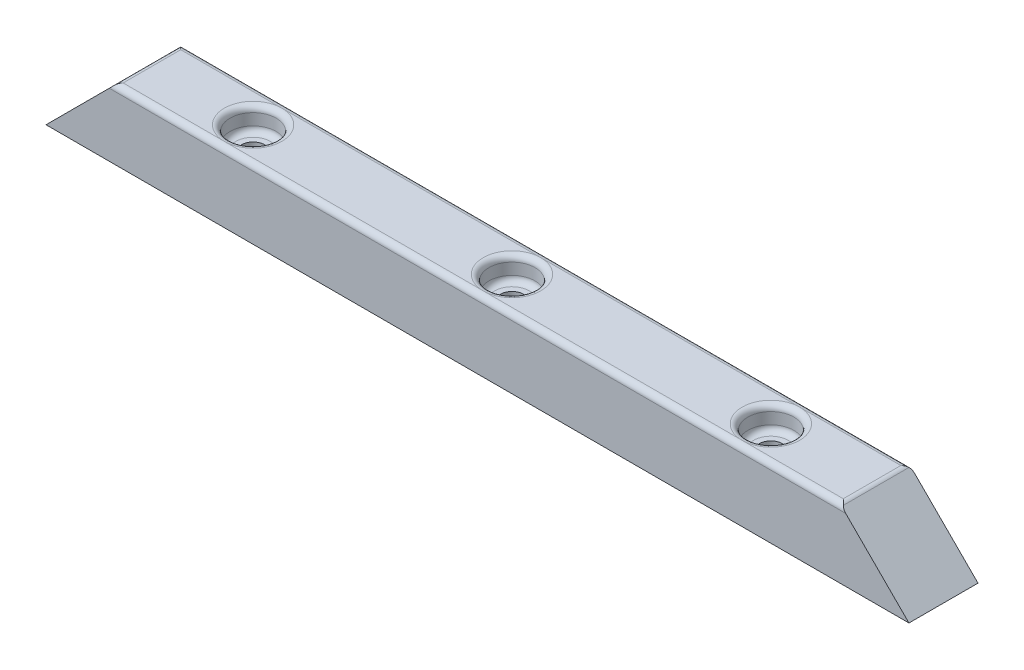
ISO-10303-21;
HEADER;
FILE_DESCRIPTION(('STEP AP214'),'2;1');
FILE_NAME('part.step','',(''),(''),'','','');
FILE_SCHEMA(('AUTOMOTIVE_DESIGN { 1 0 10303 214 1 1 1 1 }'));
ENDSEC;
DATA;
#1=APPLICATION_CONTEXT('core data for automotive mechanical design processes');
#2=APPLICATION_PROTOCOL_DEFINITION('international standard','automotive_design',2000,#1);
#3=PRODUCT_CONTEXT('',#1,'mechanical');
#4=PRODUCT('Part','Part','',(#3));
#5=PRODUCT_RELATED_PRODUCT_CATEGORY('part','',(#4));
#6=PRODUCT_DEFINITION_FORMATION('','',#4);
#7=PRODUCT_DEFINITION_CONTEXT('part definition',#1,'design');
#8=PRODUCT_DEFINITION('design','',#6,#7);
#9=PRODUCT_DEFINITION_SHAPE('','',#8);
#10=(LENGTH_UNIT() NAMED_UNIT(*) SI_UNIT(.MILLI.,.METRE.));
#11=(NAMED_UNIT(*) PLANE_ANGLE_UNIT() SI_UNIT($,.RADIAN.));
#12=(NAMED_UNIT(*) SI_UNIT($,.STERADIAN.) SOLID_ANGLE_UNIT());
#13=UNCERTAINTY_MEASURE_WITH_UNIT(LENGTH_MEASURE(1.E-05),#10,'distance_accuracy_value','');
#14=(GEOMETRIC_REPRESENTATION_CONTEXT(3) GLOBAL_UNCERTAINTY_ASSIGNED_CONTEXT((#13)) GLOBAL_UNIT_ASSIGNED_CONTEXT((#10,
#11,#12)) REPRESENTATION_CONTEXT('',''));
#15=CARTESIAN_POINT('',(0.,0.,0.));
#16=DIRECTION('',(0.,0.,1.));
#17=DIRECTION('',(1.,0.,0.));
#18=AXIS2_PLACEMENT_3D('',#15,#16,#17);
#19=CARTESIAN_POINT('',(-63.0000000000001,6.,12.));
#20=DIRECTION('',(0.,-1.,0.));
#21=DIRECTION('',(1.,0.,0.));
#22=AXIS2_PLACEMENT_3D('',#19,#20,#21);
#23=PLANE('',#22);
#24=DIRECTION('',(0.,0.,-1.));
#25=VECTOR('',#24,1.);
#26=CARTESIAN_POINT('',(-62.585786437627,6.,12.));
#27=LINE('',#26,#25);
#28=CARTESIAN_POINT('',(-62.585786437627,6.,1.));
#29=VERTEX_POINT('',#28);
#30=CARTESIAN_POINT('',(-62.585786437627,6.,11.));
#31=VERTEX_POINT('',#30);
#32=EDGE_CURVE('E213',#29,#31,#27,.F.);
#33=ORIENTED_EDGE('',*,*,#32,.T.);
#34=DIRECTION('',(-1.,0.,0.));
#35=VECTOR('',#34,1.);
#36=CARTESIAN_POINT('',(62.9999999999998,6.,11.));
#37=LINE('',#36,#35);
#38=CARTESIAN_POINT('',(-45.0000000000002,6.,11.));
#39=VERTEX_POINT('',#38);
#40=EDGE_CURVE('E222',#31,#39,#37,.F.);
#41=ORIENTED_EDGE('',*,*,#40,.T.);
#42=CARTESIAN_POINT('',(-45.0000000000002,6.,6.00000000000001));
#43=DIRECTION('',(0.,-1.,0.));
#44=DIRECTION('',(1.,0.,0.));
#45=AXIS2_PLACEMENT_3D('',#42,#43,#44);
#46=CIRCLE('',#45,5.);
#47=CARTESIAN_POINT('',(-45.0000000000002,6.,1.));
#48=VERTEX_POINT('',#47);
#49=EDGE_CURVE('E169',#39,#48,#46,.T.);
#50=ORIENTED_EDGE('',*,*,#49,.T.);
#51=DIRECTION('',(-1.,0.,0.));
#52=VECTOR('',#51,1.);
#53=CARTESIAN_POINT('',(-63.0000000000001,6.,1.));
#54=LINE('',#53,#52);
#55=EDGE_CURVE('E203',#48,#29,#54,.T.);
#56=ORIENTED_EDGE('',*,*,#55,.T.);
#57=EDGE_LOOP('',(#33,#41,#50,#56));
#58=FACE_BOUND('',#57,.T.);
#59=ADVANCED_FACE('F36',(#58),#23,.F.);
#60=EDGE_CURVE('E168',#48,#39,#46,.T.);
#61=ORIENTED_EDGE('',*,*,#60,.T.);
#62=DIRECTION('',(-1.,0.,0.));
#63=VECTOR('',#62,1.);
#64=CARTESIAN_POINT('',(62.9999999999998,6.,11.));
#65=LINE('',#64,#63);
#66=CARTESIAN_POINT('',(-1.80369938561684E-13,6.,11.));
#67=VERTEX_POINT('',#66);
#68=EDGE_CURVE('E220',#39,#67,#65,.F.);
#69=ORIENTED_EDGE('',*,*,#68,.T.);
#70=CARTESIAN_POINT('',(-1.80369938561684E-13,6.,6.));
#71=DIRECTION('',(0.,-1.,0.));
#72=DIRECTION('',(1.,0.,0.));
#73=AXIS2_PLACEMENT_3D('',#70,#71,#72);
#74=CIRCLE('',#73,5.);
#75=CARTESIAN_POINT('',(-1.80369938561684E-13,6.,1.));
#76=VERTEX_POINT('',#75);
#77=EDGE_CURVE('E161',#67,#76,#74,.T.);
#78=ORIENTED_EDGE('',*,*,#77,.T.);
#79=DIRECTION('',(-1.,0.,0.));
#80=VECTOR('',#79,1.);
#81=CARTESIAN_POINT('',(-63.0000000000001,6.,1.));
#82=LINE('',#81,#80);
#83=EDGE_CURVE('E205',#76,#48,#82,.T.);
#84=ORIENTED_EDGE('',*,*,#83,.T.);
#85=EDGE_LOOP('',(#61,#69,#78,#84));
#86=FACE_BOUND('',#85,.T.);
#87=ADVANCED_FACE('F265',(#86),#23,.F.);
#88=EDGE_CURVE('E146',#76,#67,#74,.T.);
#89=ORIENTED_EDGE('',*,*,#88,.T.);
#90=DIRECTION('',(-1.,0.,0.));
#91=VECTOR('',#90,1.);
#92=CARTESIAN_POINT('',(62.9999999999998,6.,11.));
#93=LINE('',#92,#91);
#94=CARTESIAN_POINT('',(44.9999999999998,6.,11.));
#95=VERTEX_POINT('',#94);
#96=EDGE_CURVE('E218',#67,#95,#93,.F.);
#97=ORIENTED_EDGE('',*,*,#96,.T.);
#98=CARTESIAN_POINT('',(44.9999999999998,6.,6.));
#99=DIRECTION('',(0.,-1.,0.));
#100=DIRECTION('',(1.,0.,0.));
#101=AXIS2_PLACEMENT_3D('',#98,#99,#100);
#102=CIRCLE('',#101,5.);
#103=CARTESIAN_POINT('',(44.9999999999998,6.,1.));
#104=VERTEX_POINT('',#103);
#105=EDGE_CURVE('E165',#95,#104,#102,.T.);
#106=ORIENTED_EDGE('',*,*,#105,.T.);
#107=DIRECTION('',(-1.,0.,0.));
#108=VECTOR('',#107,1.);
#109=CARTESIAN_POINT('',(-63.0000000000001,6.,1.));
#110=LINE('',#109,#108);
#111=EDGE_CURVE('E207',#104,#76,#110,.T.);
#112=ORIENTED_EDGE('',*,*,#111,.T.);
#113=EDGE_LOOP('',(#89,#97,#106,#112));
#114=FACE_BOUND('',#113,.T.);
#115=ADVANCED_FACE('F255',(#114),#23,.F.);
#116=CARTESIAN_POINT('',(-1.80452544441492E-13,-6.,6.));
#117=DIRECTION('',(0.,1.,0.));
#118=DIRECTION('',(-1.,0.,0.));
#119=AXIS2_PLACEMENT_3D('',#116,#117,#118);
#120=CYLINDRICAL_SURFACE('',#119,2.);
#121=CARTESIAN_POINT('',(-1.80452544441492E-13,-6.,6.));
#122=DIRECTION('',(0.,1.,0.));
#123=DIRECTION('',(-1.,0.,0.));
#124=AXIS2_PLACEMENT_3D('',#121,#122,#123);
#125=CIRCLE('',#124,2.);
#126=CARTESIAN_POINT('',(-2.00000000000018,-6.,6.));
#127=VERTEX_POINT('',#126);
#128=EDGE_CURVE('E412',#127,#127,#125,.T.);
#129=ORIENTED_EDGE('',*,*,#128,.F.);
#130=EDGE_LOOP('',(#129));
#131=FACE_BOUND('',#130,.T.);
#132=CARTESIAN_POINT('',(-1.80397473854953E-13,2.,6.));
#133=DIRECTION('',(0.,1.,0.));
#134=DIRECTION('',(-1.,0.,0.));
#135=AXIS2_PLACEMENT_3D('',#132,#133,#134);
#136=CIRCLE('',#135,2.);
#137=CARTESIAN_POINT('',(-2.00000000000018,2.,6.));
#138=VERTEX_POINT('',#137);
#139=EDGE_CURVE('E157',#138,#138,#136,.F.);
#140=ORIENTED_EDGE('',*,*,#139,.F.);
#141=EDGE_LOOP('',(#140));
#142=FACE_BOUND('',#141,.T.);
#143=ADVANCED_FACE('F314',(#131,#142),#120,.F.);
#144=CARTESIAN_POINT('',(44.9999999999998,-6.,6.));
#145=DIRECTION('',(0.,1.,0.));
#146=DIRECTION('',(-1.,0.,0.));
#147=AXIS2_PLACEMENT_3D('',#144,#145,#146);
#148=CYLINDRICAL_SURFACE('',#147,2.);
#149=CARTESIAN_POINT('',(44.9999999999998,-6.,6.));
#150=DIRECTION('',(0.,1.,0.));
#151=DIRECTION('',(-1.,0.,0.));
#152=AXIS2_PLACEMENT_3D('',#149,#150,#151);
#153=CIRCLE('',#152,2.);
#154=CARTESIAN_POINT('',(42.9999999999998,-6.,6.));
#155=VERTEX_POINT('',#154);
#156=EDGE_CURVE('E409',#155,#155,#153,.T.);
#157=ORIENTED_EDGE('',*,*,#156,.F.);
#158=EDGE_LOOP('',(#157));
#159=FACE_BOUND('',#158,.T.);
#160=CARTESIAN_POINT('',(44.9999999999998,2.,6.));
#161=DIRECTION('',(0.,1.,0.));
#162=DIRECTION('',(-1.,0.,0.));
#163=AXIS2_PLACEMENT_3D('',#160,#161,#162);
#164=CIRCLE('',#163,2.);
#165=CARTESIAN_POINT('',(42.9999999999998,2.,6.));
#166=VERTEX_POINT('',#165);
#167=EDGE_CURVE('E154',#166,#166,#164,.F.);
#168=ORIENTED_EDGE('',*,*,#167,.F.);
#169=EDGE_LOOP('',(#168));
#170=FACE_BOUND('',#169,.T.);
#171=ADVANCED_FACE('F318',(#159,#170),#148,.F.);
#172=CARTESIAN_POINT('',(-45.0000000000002,-6.,6.00000000000001));
#173=DIRECTION('',(0.,1.,0.));
#174=DIRECTION('',(-1.,0.,0.));
#175=AXIS2_PLACEMENT_3D('',#172,#173,#174);
#176=CYLINDRICAL_SURFACE('',#175,2.);
#177=CARTESIAN_POINT('',(-45.0000000000002,-6.,6.00000000000001));
#178=DIRECTION('',(0.,1.,0.));
#179=DIRECTION('',(-1.,0.,0.));
#180=AXIS2_PLACEMENT_3D('',#177,#178,#179);
#181=CIRCLE('',#180,2.);
#182=CARTESIAN_POINT('',(-47.0000000000002,-6.,6.00000000000001));
#183=VERTEX_POINT('',#182);
#184=EDGE_CURVE('E159',#183,#183,#181,.T.);
#185=ORIENTED_EDGE('',*,*,#184,.F.);
#186=EDGE_LOOP('',(#185));
#187=FACE_BOUND('',#186,.T.);
#188=CARTESIAN_POINT('',(-45.0000000000002,2.,6.00000000000001));
#189=DIRECTION('',(0.,1.,0.));
#190=DIRECTION('',(-1.,0.,0.));
#191=AXIS2_PLACEMENT_3D('',#188,#189,#190);
#192=CIRCLE('',#191,2.);
#193=CARTESIAN_POINT('',(-47.0000000000002,2.,6.00000000000001));
#194=VERTEX_POINT('',#193);
#195=EDGE_CURVE('E151',#194,#194,#192,.F.);
#196=ORIENTED_EDGE('',*,*,#195,.F.);
#197=EDGE_LOOP('',(#196));
#198=FACE_BOUND('',#197,.T.);
#199=ADVANCED_FACE('F324',(#187,#198),#176,.F.);
#200=CARTESIAN_POINT('',(-75.0000000000001,-6.,12.));
#201=DIRECTION('',(0.,1.,0.));
#202=DIRECTION('',(0.,0.,1.));
#203=AXIS2_PLACEMENT_3D('',#200,#201,#202);
#204=PLANE('',#203);
#205=ORIENTED_EDGE('',*,*,#184,.T.);
#206=EDGE_LOOP('',(#205));
#207=FACE_BOUND('',#206,.T.);
#208=ORIENTED_EDGE('',*,*,#156,.T.);
#209=EDGE_LOOP('',(#208));
#210=FACE_BOUND('',#209,.T.);
#211=ORIENTED_EDGE('',*,*,#128,.T.);
#212=EDGE_LOOP('',(#211));
#213=FACE_BOUND('',#212,.T.);
#214=DIRECTION('',(1.,0.,0.));
#215=VECTOR('',#214,1.);
#216=CARTESIAN_POINT('',(-75.0000000000001,-6.,0.));
#217=LINE('',#216,#215);
#218=CARTESIAN_POINT('',(-75.0000000000001,-6.,0.));
#219=VERTEX_POINT('',#218);
#220=CARTESIAN_POINT('',(74.9999999999999,-6.,0.));
#221=VERTEX_POINT('',#220);
#222=EDGE_CURVE('E141',#219,#221,#217,.T.);
#223=ORIENTED_EDGE('',*,*,#222,.T.);
#224=DIRECTION('',(0.,0.,-1.));
#225=VECTOR('',#224,1.);
#226=CARTESIAN_POINT('',(74.9999999999999,-6.,12.));
#227=LINE('',#226,#225);
#228=CARTESIAN_POINT('',(74.9999999999999,-6.,12.));
#229=VERTEX_POINT('',#228);
#230=EDGE_CURVE('E122',#229,#221,#227,.T.);
#231=ORIENTED_EDGE('',*,*,#230,.F.);
#232=DIRECTION('',(1.,0.,0.));
#233=VECTOR('',#232,1.);
#234=CARTESIAN_POINT('',(-75.0000000000001,-6.,12.));
#235=LINE('',#234,#233);
#236=CARTESIAN_POINT('',(-75.0000000000001,-6.,12.));
#237=VERTEX_POINT('',#236);
#238=EDGE_CURVE('E129',#237,#229,#235,.T.);
#239=ORIENTED_EDGE('',*,*,#238,.F.);
#240=DIRECTION('',(0.,0.,-1.));
#241=VECTOR('',#240,1.);
#242=CARTESIAN_POINT('',(-75.0000000000001,-6.,12.));
#243=LINE('',#242,#241);
#244=EDGE_CURVE('E143',#237,#219,#243,.T.);
#245=ORIENTED_EDGE('',*,*,#244,.T.);
#246=EDGE_LOOP('',(#223,#231,#239,#245));
#247=FACE_BOUND('',#246,.T.);
#248=ADVANCED_FACE('F139',(#207,#210,#213,#247),#204,.F.);
#249=CARTESIAN_POINT('',(74.9999999999999,-6.,12.));
#250=DIRECTION('',(-0.707106781186544,-0.707106781186551,0.));
#251=DIRECTION('',(0.707106781186551,-0.707106781186544,0.));
#252=AXIS2_PLACEMENT_3D('',#249,#250,#251);
#253=PLANE('',#252);
#254=DIRECTION('',(0.,0.,-1.));
#255=VECTOR('',#254,1.);
#256=CARTESIAN_POINT('',(63.2928932188132,5.70710678118653,12.));
#257=LINE('',#256,#255);
#258=CARTESIAN_POINT('',(63.2928932188132,5.70710678118653,0.292893218813444));
#259=VERTEX_POINT('',#258);
#260=CARTESIAN_POINT('',(63.2928932188132,5.70710678118653,11.7071067811866));
#261=VERTEX_POINT('',#260);
#262=EDGE_CURVE('E53',#259,#261,#257,.F.);
#263=ORIENTED_EDGE('',*,*,#262,.T.);
#264=CARTESIAN_POINT('',(63.9999999999998,5.,11.));
#265=DIRECTION('',(-0.707106781186544,-0.707106781186551,0.));
#266=DIRECTION('',(0.707106781186551,-0.707106781186544,0.));
#267=AXIS2_PLACEMENT_3D('',#264,#265,#266);
#268=ELLIPSE('',#267,1.4142135623731,1.);
#269=CARTESIAN_POINT('',(63.9999999999998,5.,12.));
#270=VERTEX_POINT('',#269);
#271=EDGE_CURVE('E125',#261,#270,#268,.F.);
#272=ORIENTED_EDGE('',*,*,#271,.T.);
#273=DIRECTION('',(-0.707106781186552,0.707106781186544,0.));
#274=VECTOR('',#273,1.);
#275=CARTESIAN_POINT('',(74.9999999999999,-6.,12.));
#276=LINE('',#275,#274);
#277=EDGE_CURVE('E118',#229,#270,#276,.T.);
#278=ORIENTED_EDGE('',*,*,#277,.F.);
#279=ORIENTED_EDGE('',*,*,#230,.T.);
#280=DIRECTION('',(-0.707106781186552,0.707106781186544,0.));
#281=VECTOR('',#280,1.);
#282=CARTESIAN_POINT('',(74.9999999999999,-6.,0.));
#283=LINE('',#282,#281);
#284=CARTESIAN_POINT('',(63.9999999999998,5.,0.));
#285=VERTEX_POINT('',#284);
#286=EDGE_CURVE('E344',#221,#285,#283,.T.);
#287=ORIENTED_EDGE('',*,*,#286,.T.);
#288=CARTESIAN_POINT('',(63.9999999999998,5.,1.));
#289=DIRECTION('',(-0.707106781186544,-0.707106781186551,0.));
#290=DIRECTION('',(-0.707106781186551,0.707106781186544,0.));
#291=AXIS2_PLACEMENT_3D('',#288,#289,#290);
#292=ELLIPSE('',#291,1.4142135623731,1.);
#293=EDGE_CURVE('E58',#285,#259,#292,.F.);
#294=ORIENTED_EDGE('',*,*,#293,.T.);
#295=EDGE_LOOP('',(#263,#272,#278,#279,#287,#294));
#296=FACE_BOUND('',#295,.T.);
#297=ADVANCED_FACE('F120',(#296),#253,.F.);
#298=EDGE_CURVE('E164',#104,#95,#102,.T.);
#299=ORIENTED_EDGE('',*,*,#298,.T.);
#300=DIRECTION('',(-1.,0.,0.));
#301=VECTOR('',#300,1.);
#302=CARTESIAN_POINT('',(62.9999999999998,6.,11.));
#303=LINE('',#302,#301);
#304=CARTESIAN_POINT('',(62.5857864376267,6.,11.));
#305=VERTEX_POINT('',#304);
#306=EDGE_CURVE('E216',#95,#305,#303,.F.);
#307=ORIENTED_EDGE('',*,*,#306,.T.);
#308=DIRECTION('',(0.,0.,-1.));
#309=VECTOR('',#308,1.);
#310=CARTESIAN_POINT('',(62.5857864376267,6.,12.));
#311=LINE('',#310,#309);
#312=CARTESIAN_POINT('',(62.5857864376267,6.,1.));
#313=VERTEX_POINT('',#312);
#314=EDGE_CURVE('E211',#305,#313,#311,.T.);
#315=ORIENTED_EDGE('',*,*,#314,.T.);
#316=DIRECTION('',(-1.,0.,0.));
#317=VECTOR('',#316,1.);
#318=CARTESIAN_POINT('',(-63.0000000000001,6.,1.));
#319=LINE('',#318,#317);
#320=EDGE_CURVE('E209',#313,#104,#319,.T.);
#321=ORIENTED_EDGE('',*,*,#320,.T.);
#322=EDGE_LOOP('',(#299,#307,#315,#321));
#323=FACE_BOUND('',#322,.T.);
#324=ADVANCED_FACE('F246',(#323),#23,.F.);
#325=CARTESIAN_POINT('',(-75.0000000000001,-6.,12.));
#326=DIRECTION('',(0.707106781186549,-0.707106781186546,0.));
#327=DIRECTION('',(0.707106781186546,0.707106781186549,0.));
#328=AXIS2_PLACEMENT_3D('',#325,#326,#327);
#329=PLANE('',#328);
#330=DIRECTION('',(-0.707106781186546,-0.707106781186549,0.));
#331=VECTOR('',#330,1.);
#332=CARTESIAN_POINT('',(-75.0000000000001,-6.,12.));
#333=LINE('',#332,#331);
#334=CARTESIAN_POINT('',(-64.0000000000001,5.,12.));
#335=VERTEX_POINT('',#334);
#336=EDGE_CURVE('E128',#335,#237,#333,.T.);
#337=ORIENTED_EDGE('',*,*,#336,.F.);
#338=CARTESIAN_POINT('',(-64.0000000000001,5.,11.));
#339=DIRECTION('',(0.707106781186549,-0.707106781186546,0.));
#340=DIRECTION('',(0.707106781186546,0.707106781186549,0.));
#341=AXIS2_PLACEMENT_3D('',#338,#339,#340);
#342=ELLIPSE('',#341,1.41421356237309,1.);
#343=CARTESIAN_POINT('',(-63.2928932188136,5.70710678118654,11.7071067811866));
#344=VERTEX_POINT('',#343);
#345=EDGE_CURVE('E201',#335,#344,#342,.F.);
#346=ORIENTED_EDGE('',*,*,#345,.T.);
#347=DIRECTION('',(0.,0.,-1.));
#348=VECTOR('',#347,1.);
#349=CARTESIAN_POINT('',(-63.2928932188136,5.70710678118654,12.));
#350=LINE('',#349,#348);
#351=CARTESIAN_POINT('',(-63.2928932188136,5.70710678118654,0.292893218813447));
#352=VERTEX_POINT('',#351);
#353=EDGE_CURVE('E198',#344,#352,#350,.T.);
#354=ORIENTED_EDGE('',*,*,#353,.T.);
#355=CARTESIAN_POINT('',(-64.0000000000001,5.,1.));
#356=DIRECTION('',(0.707106781186549,-0.707106781186546,0.));
#357=DIRECTION('',(-0.707106781186546,-0.707106781186549,0.));
#358=AXIS2_PLACEMENT_3D('',#355,#356,#357);
#359=ELLIPSE('',#358,1.41421356237309,1.);
#360=CARTESIAN_POINT('',(-64.0000000000001,5.,0.));
#361=VERTEX_POINT('',#360);
#362=EDGE_CURVE('E196',#352,#361,#359,.F.);
#363=ORIENTED_EDGE('',*,*,#362,.T.);
#364=DIRECTION('',(-0.707106781186546,-0.707106781186549,0.));
#365=VECTOR('',#364,1.);
#366=CARTESIAN_POINT('',(-75.0000000000001,-6.,0.));
#367=LINE('',#366,#365);
#368=EDGE_CURVE('E137',#361,#219,#367,.T.);
#369=ORIENTED_EDGE('',*,*,#368,.T.);
#370=ORIENTED_EDGE('',*,*,#244,.F.);
#371=EDGE_LOOP('',(#337,#346,#354,#363,#369,#370));
#372=FACE_BOUND('',#371,.T.);
#373=ADVANCED_FACE('F307',(#372),#329,.F.);
#374=CARTESIAN_POINT('',(0.,0.,12.));
#375=DIRECTION('',(0.,0.,1.));
#376=DIRECTION('',(1.,0.,0.));
#377=AXIS2_PLACEMENT_3D('',#374,#375,#376);
#378=PLANE('',#377);
#379=ORIENTED_EDGE('',*,*,#277,.T.);
#380=DIRECTION('',(-1.,0.,0.));
#381=VECTOR('',#380,1.);
#382=CARTESIAN_POINT('',(-63.0000000000001,5.,12.));
#383=LINE('',#382,#381);
#384=EDGE_CURVE('E45',#270,#335,#383,.T.);
#385=ORIENTED_EDGE('',*,*,#384,.T.);
#386=ORIENTED_EDGE('',*,*,#336,.T.);
#387=ORIENTED_EDGE('',*,*,#238,.T.);
#388=EDGE_LOOP('',(#379,#385,#386,#387));
#389=FACE_BOUND('',#388,.T.);
#390=ADVANCED_FACE('F132',(#389),#378,.T.);
#391=CARTESIAN_POINT('',(0.,0.,0.));
#392=DIRECTION('',(0.,0.,1.));
#393=DIRECTION('',(1.,0.,0.));
#394=AXIS2_PLACEMENT_3D('',#391,#392,#393);
#395=PLANE('',#394);
#396=ORIENTED_EDGE('',*,*,#368,.F.);
#397=DIRECTION('',(-1.,0.,0.));
#398=VECTOR('',#397,1.);
#399=CARTESIAN_POINT('',(0.,5.,0.));
#400=LINE('',#399,#398);
#401=EDGE_CURVE('E11',#361,#285,#400,.F.);
#402=ORIENTED_EDGE('',*,*,#401,.T.);
#403=ORIENTED_EDGE('',*,*,#286,.F.);
#404=ORIENTED_EDGE('',*,*,#222,.F.);
#405=EDGE_LOOP('',(#396,#402,#403,#404));
#406=FACE_BOUND('',#405,.T.);
#407=ADVANCED_FACE('F333',(#406),#395,.F.);
#408=CARTESIAN_POINT('',(-45.0000000000002,2.,6.00000000000001));
#409=DIRECTION('',(0.,1.,0.));
#410=DIRECTION('',(-1.,0.,0.));
#411=AXIS2_PLACEMENT_3D('',#408,#409,#410);
#412=PLANE('',#411);
#413=CARTESIAN_POINT('',(-45.0000000000002,2.,6.00000000000001));
#414=DIRECTION('',(0.,1.,0.));
#415=DIRECTION('',(-1.,0.,0.));
#416=AXIS2_PLACEMENT_3D('',#413,#414,#415);
#417=CIRCLE('',#416,3.);
#418=CARTESIAN_POINT('',(-48.0000000000002,2.,6.00000000000001));
#419=VERTEX_POINT('',#418);
#420=EDGE_CURVE('E178',#419,#419,#417,.T.);
#421=ORIENTED_EDGE('',*,*,#420,.T.);
#422=EDGE_LOOP('',(#421));
#423=FACE_BOUND('',#422,.T.);
#424=ORIENTED_EDGE('',*,*,#195,.T.);
#425=EDGE_LOOP('',(#424));
#426=FACE_BOUND('',#425,.T.);
#427=ADVANCED_FACE('F335',(#423,#426),#412,.T.);
#428=CARTESIAN_POINT('',(-45.0000000000002,2.,6.00000000000001));
#429=DIRECTION('',(0.,1.,0.));
#430=DIRECTION('',(-1.,0.,0.));
#431=AXIS2_PLACEMENT_3D('',#428,#429,#430);
#432=CYLINDRICAL_SURFACE('',#431,4.);
#433=CARTESIAN_POINT('',(-45.0000000000002,3.,6.00000000000001));
#434=DIRECTION('',(0.,1.,0.));
#435=DIRECTION('',(-1.,0.,0.));
#436=AXIS2_PLACEMENT_3D('',#433,#434,#435);
#437=CIRCLE('',#436,4.);
#438=CARTESIAN_POINT('',(-49.0000000000002,3.,6.00000000000001));
#439=VERTEX_POINT('',#438);
#440=EDGE_CURVE('E181',#439,#439,#437,.F.);
#441=ORIENTED_EDGE('',*,*,#440,.T.);
#442=EDGE_LOOP('',(#441));
#443=FACE_BOUND('',#442,.T.);
#444=CARTESIAN_POINT('',(-45.0000000000002,5.,6.00000000000001));
#445=DIRECTION('',(0.,-1.,0.));
#446=DIRECTION('',(1.,0.,0.));
#447=AXIS2_PLACEMENT_3D('',#444,#445,#446);
#448=CIRCLE('',#447,4.);
#449=CARTESIAN_POINT('',(-41.0000000000002,5.,6.00000000000001));
#450=VERTEX_POINT('',#449);
#451=EDGE_CURVE('E142',#450,#450,#448,.F.);
#452=ORIENTED_EDGE('',*,*,#451,.T.);
#453=EDGE_LOOP('',(#452));
#454=FACE_BOUND('',#453,.T.);
#455=ADVANCED_FACE('F340',(#443,#454),#432,.F.);
#456=CARTESIAN_POINT('',(44.9999999999998,2.,6.));
#457=DIRECTION('',(0.,1.,0.));
#458=DIRECTION('',(-1.,0.,0.));
#459=AXIS2_PLACEMENT_3D('',#456,#457,#458);
#460=PLANE('',#459);
#461=CARTESIAN_POINT('',(44.9999999999998,2.,6.));
#462=DIRECTION('',(0.,1.,0.));
#463=DIRECTION('',(-1.,0.,0.));
#464=AXIS2_PLACEMENT_3D('',#461,#462,#463);
#465=CIRCLE('',#464,3.);
#466=CARTESIAN_POINT('',(41.9999999999998,2.,6.));
#467=VERTEX_POINT('',#466);
#468=EDGE_CURVE('E190',#467,#467,#465,.T.);
#469=ORIENTED_EDGE('',*,*,#468,.T.);
#470=EDGE_LOOP('',(#469));
#471=FACE_BOUND('',#470,.T.);
#472=ORIENTED_EDGE('',*,*,#167,.T.);
#473=EDGE_LOOP('',(#472));
#474=FACE_BOUND('',#473,.T.);
#475=ADVANCED_FACE('F374',(#471,#474),#460,.T.);
#476=CARTESIAN_POINT('',(44.9999999999998,2.,6.));
#477=DIRECTION('',(0.,1.,0.));
#478=DIRECTION('',(-1.,0.,0.));
#479=AXIS2_PLACEMENT_3D('',#476,#477,#478);
#480=CYLINDRICAL_SURFACE('',#479,4.);
#481=CARTESIAN_POINT('',(44.9999999999998,3.,6.));
#482=DIRECTION('',(0.,1.,0.));
#483=DIRECTION('',(-1.,0.,0.));
#484=AXIS2_PLACEMENT_3D('',#481,#482,#483);
#485=CIRCLE('',#484,4.);
#486=CARTESIAN_POINT('',(40.9999999999998,3.,6.));
#487=VERTEX_POINT('',#486);
#488=EDGE_CURVE('E193',#487,#487,#485,.F.);
#489=ORIENTED_EDGE('',*,*,#488,.T.);
#490=EDGE_LOOP('',(#489));
#491=FACE_BOUND('',#490,.T.);
#492=CARTESIAN_POINT('',(44.9999999999998,5.,6.));
#493=DIRECTION('',(0.,-1.,0.));
#494=DIRECTION('',(1.,0.,0.));
#495=AXIS2_PLACEMENT_3D('',#492,#493,#494);
#496=CIRCLE('',#495,4.);
#497=CARTESIAN_POINT('',(48.9999999999998,5.,6.));
#498=VERTEX_POINT('',#497);
#499=EDGE_CURVE('E172',#498,#498,#496,.F.);
#500=ORIENTED_EDGE('',*,*,#499,.T.);
#501=EDGE_LOOP('',(#500));
#502=FACE_BOUND('',#501,.T.);
#503=ADVANCED_FACE('F295',(#491,#502),#480,.F.);
#504=CARTESIAN_POINT('',(-1.80397473854953E-13,2.,6.));
#505=DIRECTION('',(0.,1.,0.));
#506=DIRECTION('',(-1.,0.,0.));
#507=AXIS2_PLACEMENT_3D('',#504,#505,#506);
#508=PLANE('',#507);
#509=CARTESIAN_POINT('',(-1.80397473854953E-13,2.,6.));
#510=DIRECTION('',(0.,1.,0.));
#511=DIRECTION('',(-1.,0.,0.));
#512=AXIS2_PLACEMENT_3D('',#509,#510,#511);
#513=CIRCLE('',#512,3.);
#514=CARTESIAN_POINT('',(-3.00000000000018,2.,6.));
#515=VERTEX_POINT('',#514);
#516=EDGE_CURVE('E184',#515,#515,#513,.T.);
#517=ORIENTED_EDGE('',*,*,#516,.T.);
#518=EDGE_LOOP('',(#517));
#519=FACE_BOUND('',#518,.T.);
#520=ORIENTED_EDGE('',*,*,#139,.T.);
#521=EDGE_LOOP('',(#520));
#522=FACE_BOUND('',#521,.T.);
#523=ADVANCED_FACE('F287',(#519,#522),#508,.T.);
#524=CARTESIAN_POINT('',(-1.80397473854953E-13,2.,6.));
#525=DIRECTION('',(0.,1.,0.));
#526=DIRECTION('',(-1.,0.,0.));
#527=AXIS2_PLACEMENT_3D('',#524,#525,#526);
#528=CYLINDRICAL_SURFACE('',#527,4.);
#529=CARTESIAN_POINT('',(-1.80390590031636E-13,3.,6.));
#530=DIRECTION('',(0.,1.,0.));
#531=DIRECTION('',(-1.,0.,0.));
#532=AXIS2_PLACEMENT_3D('',#529,#530,#531);
#533=CIRCLE('',#532,4.);
#534=CARTESIAN_POINT('',(-4.00000000000018,3.,6.));
#535=VERTEX_POINT('',#534);
#536=EDGE_CURVE('E187',#535,#535,#533,.F.);
#537=ORIENTED_EDGE('',*,*,#536,.T.);
#538=EDGE_LOOP('',(#537));
#539=FACE_BOUND('',#538,.T.);
#540=CARTESIAN_POINT('',(-1.80376822385001E-13,5.,6.));
#541=DIRECTION('',(0.,-1.,0.));
#542=DIRECTION('',(1.,0.,0.));
#543=AXIS2_PLACEMENT_3D('',#540,#541,#542);
#544=CIRCLE('',#543,4.);
#545=CARTESIAN_POINT('',(3.99999999999982,5.,6.));
#546=VERTEX_POINT('',#545);
#547=EDGE_CURVE('E175',#546,#546,#544,.F.);
#548=ORIENTED_EDGE('',*,*,#547,.T.);
#549=EDGE_LOOP('',(#548));
#550=FACE_BOUND('',#549,.T.);
#551=ADVANCED_FACE('F285',(#539,#550),#528,.F.);
#552=CARTESIAN_POINT('',(-45.0000000000002,5.,6.00000000000001));
#553=DIRECTION('',(0.,-1.,0.));
#554=DIRECTION('',(1.,0.,0.));
#555=AXIS2_PLACEMENT_3D('',#552,#553,#554);
#556=TOROIDAL_SURFACE('',#555,5.,1.);
#557=ORIENTED_EDGE('',*,*,#49,.F.);
#558=ORIENTED_EDGE('',*,*,#60,.F.);
#559=EDGE_LOOP('',(#557,#558));
#560=FACE_BOUND('',#559,.T.);
#561=ORIENTED_EDGE('',*,*,#451,.F.);
#562=EDGE_LOOP('',(#561));
#563=FACE_BOUND('',#562,.T.);
#564=ADVANCED_FACE('F269',(#560,#563),#556,.T.);
#565=CARTESIAN_POINT('',(44.9999999999998,5.,6.));
#566=DIRECTION('',(0.,-1.,0.));
#567=DIRECTION('',(1.,0.,0.));
#568=AXIS2_PLACEMENT_3D('',#565,#566,#567);
#569=TOROIDAL_SURFACE('',#568,5.,1.);
#570=ORIENTED_EDGE('',*,*,#105,.F.);
#571=ORIENTED_EDGE('',*,*,#298,.F.);
#572=EDGE_LOOP('',(#570,#571));
#573=FACE_BOUND('',#572,.T.);
#574=ORIENTED_EDGE('',*,*,#499,.F.);
#575=EDGE_LOOP('',(#574));
#576=FACE_BOUND('',#575,.T.);
#577=ADVANCED_FACE('F250',(#573,#576),#569,.T.);
#578=CARTESIAN_POINT('',(-1.80376822385001E-13,5.,6.));
#579=DIRECTION('',(0.,-1.,0.));
#580=DIRECTION('',(1.,0.,0.));
#581=AXIS2_PLACEMENT_3D('',#578,#579,#580);
#582=TOROIDAL_SURFACE('',#581,5.,1.);
#583=ORIENTED_EDGE('',*,*,#77,.F.);
#584=ORIENTED_EDGE('',*,*,#88,.F.);
#585=EDGE_LOOP('',(#583,#584));
#586=FACE_BOUND('',#585,.T.);
#587=ORIENTED_EDGE('',*,*,#547,.F.);
#588=EDGE_LOOP('',(#587));
#589=FACE_BOUND('',#588,.T.);
#590=ADVANCED_FACE('F278',(#586,#589),#582,.T.);
#591=CARTESIAN_POINT('',(-45.0000000000002,3.,6.00000000000001));
#592=DIRECTION('',(0.,1.,0.));
#593=DIRECTION('',(-1.,0.,0.));
#594=AXIS2_PLACEMENT_3D('',#591,#592,#593);
#595=TOROIDAL_SURFACE('',#594,3.,1.);
#596=ORIENTED_EDGE('',*,*,#440,.F.);
#597=EDGE_LOOP('',(#596));
#598=FACE_BOUND('',#597,.T.);
#599=ORIENTED_EDGE('',*,*,#420,.F.);
#600=EDGE_LOOP('',(#599));
#601=FACE_BOUND('',#600,.T.);
#602=ADVANCED_FACE('F281',(#598,#601),#595,.F.);
#603=CARTESIAN_POINT('',(-1.80390590031636E-13,3.,6.));
#604=DIRECTION('',(0.,1.,0.));
#605=DIRECTION('',(-1.,0.,0.));
#606=AXIS2_PLACEMENT_3D('',#603,#604,#605);
#607=TOROIDAL_SURFACE('',#606,3.,1.);
#608=ORIENTED_EDGE('',*,*,#536,.F.);
#609=EDGE_LOOP('',(#608));
#610=FACE_BOUND('',#609,.T.);
#611=ORIENTED_EDGE('',*,*,#516,.F.);
#612=EDGE_LOOP('',(#611));
#613=FACE_BOUND('',#612,.T.);
#614=ADVANCED_FACE('F364',(#610,#613),#607,.F.);
#615=CARTESIAN_POINT('',(44.9999999999998,3.,6.));
#616=DIRECTION('',(0.,1.,0.));
#617=DIRECTION('',(-1.,0.,0.));
#618=AXIS2_PLACEMENT_3D('',#615,#616,#617);
#619=TOROIDAL_SURFACE('',#618,3.,1.);
#620=ORIENTED_EDGE('',*,*,#488,.F.);
#621=EDGE_LOOP('',(#620));
#622=FACE_BOUND('',#621,.T.);
#623=ORIENTED_EDGE('',*,*,#468,.F.);
#624=EDGE_LOOP('',(#623));
#625=FACE_BOUND('',#624,.T.);
#626=ADVANCED_FACE('F355',(#622,#625),#619,.F.);
#627=CARTESIAN_POINT('',(62.5857864376267,5.,12.));
#628=DIRECTION('',(0.,0.,-1.));
#629=DIRECTION('',(-1.,0.,0.));
#630=AXIS2_PLACEMENT_3D('',#627,#628,#629);
#631=CYLINDRICAL_SURFACE('',#630,1.);
#632=CARTESIAN_POINT('',(62.5857864376267,5.,1.));
#633=DIRECTION('',(-0.707106781186547,0.,-0.707106781186547));
#634=DIRECTION('',(-0.707106781186547,0.,0.707106781186547));
#635=AXIS2_PLACEMENT_3D('',#632,#633,#634);
#636=ELLIPSE('',#635,1.41421356237309,1.);
#637=EDGE_CURVE('E231',#313,#259,#636,.T.);
#638=ORIENTED_EDGE('',*,*,#637,.F.);
#639=ORIENTED_EDGE('',*,*,#314,.F.);
#640=CARTESIAN_POINT('',(62.5857864376267,5.,11.));
#641=DIRECTION('',(0.707106781186547,0.,-0.707106781186547));
#642=DIRECTION('',(0.707106781186547,0.,0.707106781186547));
#643=AXIS2_PLACEMENT_3D('',#640,#641,#642);
#644=ELLIPSE('',#643,1.41421356237309,1.);
#645=EDGE_CURVE('E40',#261,#305,#644,.F.);
#646=ORIENTED_EDGE('',*,*,#645,.F.);
#647=ORIENTED_EDGE('',*,*,#262,.F.);
#648=EDGE_LOOP('',(#638,#639,#646,#647));
#649=FACE_BOUND('',#648,.T.);
#650=ADVANCED_FACE('F38',(#649),#631,.T.);
#651=CARTESIAN_POINT('',(0.,5.,11.));
#652=DIRECTION('',(1.,0.,0.));
#653=DIRECTION('',(0.,1.,0.));
#654=AXIS2_PLACEMENT_3D('',#651,#652,#653);
#655=CYLINDRICAL_SURFACE('',#654,1.);
#656=ORIENTED_EDGE('',*,*,#68,.F.);
#657=ORIENTED_EDGE('',*,*,#40,.F.);
#658=CARTESIAN_POINT('',(-62.585786437627,5.,11.));
#659=DIRECTION('',(0.707106781186547,0.,0.707106781186547));
#660=DIRECTION('',(0.707106781186547,0.,-0.707106781186547));
#661=AXIS2_PLACEMENT_3D('',#658,#659,#660);
#662=ELLIPSE('',#661,1.41421356237309,1.);
#663=EDGE_CURVE('E230',#344,#31,#662,.F.);
#664=ORIENTED_EDGE('',*,*,#663,.F.);
#665=ORIENTED_EDGE('',*,*,#345,.F.);
#666=ORIENTED_EDGE('',*,*,#384,.F.);
#667=ORIENTED_EDGE('',*,*,#271,.F.);
#668=ORIENTED_EDGE('',*,*,#645,.T.);
#669=ORIENTED_EDGE('',*,*,#306,.F.);
#670=ORIENTED_EDGE('',*,*,#96,.F.);
#671=EDGE_LOOP('',(#656,#657,#664,#665,#666,#667,#668,#669,#670));
#672=FACE_BOUND('',#671,.T.);
#673=ADVANCED_FACE('F240',(#672),#655,.T.);
#674=CARTESIAN_POINT('',(-63.0000000000001,5.,1.));
#675=DIRECTION('',(-1.,0.,0.));
#676=DIRECTION('',(0.,-1.,0.));
#677=AXIS2_PLACEMENT_3D('',#674,#675,#676);
#678=CYLINDRICAL_SURFACE('',#677,1.);
#679=ORIENTED_EDGE('',*,*,#401,.F.);
#680=ORIENTED_EDGE('',*,*,#362,.F.);
#681=CARTESIAN_POINT('',(-62.585786437627,5.,1.));
#682=DIRECTION('',(-0.707106781186547,0.,0.707106781186547));
#683=DIRECTION('',(-0.707106781186547,0.,-0.707106781186547));
#684=AXIS2_PLACEMENT_3D('',#681,#682,#683);
#685=ELLIPSE('',#684,1.41421356237309,1.);
#686=EDGE_CURVE('E228',#29,#352,#685,.T.);
#687=ORIENTED_EDGE('',*,*,#686,.F.);
#688=ORIENTED_EDGE('',*,*,#55,.F.);
#689=ORIENTED_EDGE('',*,*,#83,.F.);
#690=ORIENTED_EDGE('',*,*,#111,.F.);
#691=ORIENTED_EDGE('',*,*,#320,.F.);
#692=ORIENTED_EDGE('',*,*,#637,.T.);
#693=ORIENTED_EDGE('',*,*,#293,.F.);
#694=EDGE_LOOP('',(#679,#680,#687,#688,#689,#690,#691,#692,#693));
#695=FACE_BOUND('',#694,.T.);
#696=ADVANCED_FACE('F259',(#695),#678,.T.);
#697=CARTESIAN_POINT('',(-62.585786437627,5.,12.));
#698=DIRECTION('',(0.,0.,-1.));
#699=DIRECTION('',(-1.,0.,0.));
#700=AXIS2_PLACEMENT_3D('',#697,#698,#699);
#701=CYLINDRICAL_SURFACE('',#700,1.);
#702=ORIENTED_EDGE('',*,*,#663,.T.);
#703=ORIENTED_EDGE('',*,*,#32,.F.);
#704=ORIENTED_EDGE('',*,*,#686,.T.);
#705=ORIENTED_EDGE('',*,*,#353,.F.);
#706=EDGE_LOOP('',(#702,#703,#704,#705));
#707=FACE_BOUND('',#706,.T.);
#708=ADVANCED_FACE('F347',(#707),#701,.T.);
#709=CLOSED_SHELL('',(#59,#87,#115,#143,#171,#199,#248,#297,#324,#373,#390,#407,#427,#455,#475,
#503,#523,#551,#564,#577,#590,#602,#614,#626,#650,#673,#696,#708));
#710=MANIFOLD_SOLID_BREP('B2',#709);
#711=ADVANCED_BREP_SHAPE_REPRESENTATION('',(#18,#710),#14);
#712=SHAPE_DEFINITION_REPRESENTATION(#9,#711);
ENDSEC;
END-ISO-10303-21;
